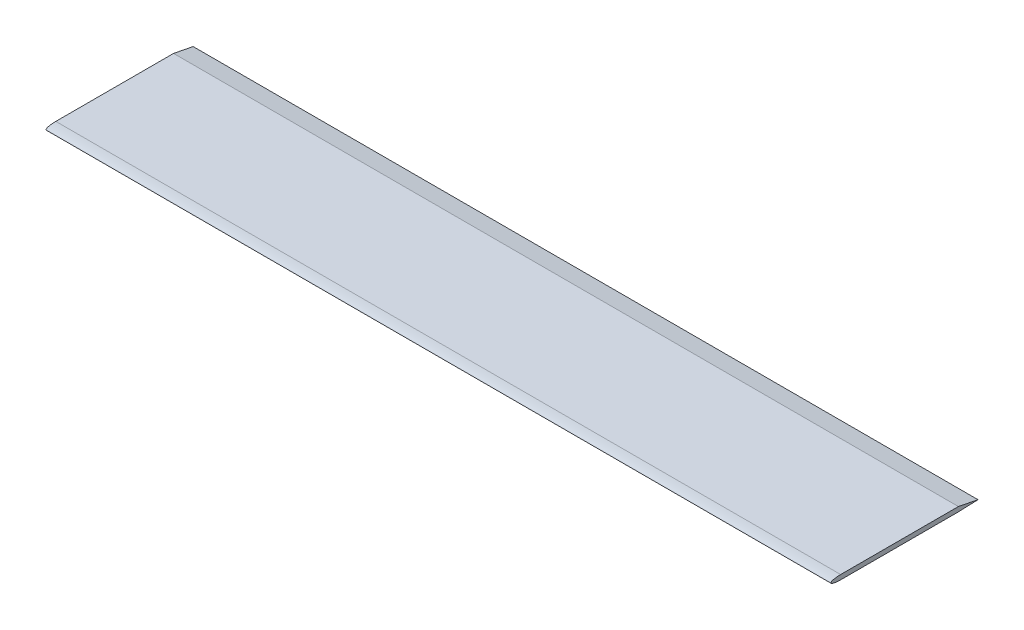
ISO-10303-21;
HEADER;
FILE_DESCRIPTION(('STEP AP214'),'2;1');
FILE_NAME('part.step','',(''),(''),'','','');
FILE_SCHEMA(('AUTOMOTIVE_DESIGN { 1 0 10303 214 1 1 1 1 }'));
ENDSEC;
DATA;
#1=APPLICATION_CONTEXT('core data for automotive mechanical design processes');
#2=APPLICATION_PROTOCOL_DEFINITION('international standard','automotive_design',2000,#1);
#3=PRODUCT_CONTEXT('',#1,'mechanical');
#4=PRODUCT('Part','Part','',(#3));
#5=PRODUCT_RELATED_PRODUCT_CATEGORY('part','',(#4));
#6=PRODUCT_DEFINITION_FORMATION('','',#4);
#7=PRODUCT_DEFINITION_CONTEXT('part definition',#1,'design');
#8=PRODUCT_DEFINITION('design','',#6,#7);
#9=PRODUCT_DEFINITION_SHAPE('','',#8);
#10=(LENGTH_UNIT() NAMED_UNIT(*) SI_UNIT(.MILLI.,.METRE.));
#11=(NAMED_UNIT(*) PLANE_ANGLE_UNIT() SI_UNIT($,.RADIAN.));
#12=(NAMED_UNIT(*) SI_UNIT($,.STERADIAN.) SOLID_ANGLE_UNIT());
#13=UNCERTAINTY_MEASURE_WITH_UNIT(LENGTH_MEASURE(1.E-05),#10,'distance_accuracy_value','');
#14=(GEOMETRIC_REPRESENTATION_CONTEXT(3) GLOBAL_UNCERTAINTY_ASSIGNED_CONTEXT((#13)) GLOBAL_UNIT_ASSIGNED_CONTEXT((#10,
#11,#12)) REPRESENTATION_CONTEXT('',''));
#15=CARTESIAN_POINT('',(0.,0.,0.));
#16=DIRECTION('',(0.,0.,1.));
#17=DIRECTION('',(1.,0.,0.));
#18=AXIS2_PLACEMENT_3D('',#15,#16,#17);
#19=CARTESIAN_POINT('',(1016.,2.999999969,0.));
#20=DIRECTION('',(0.,-1.,0.));
#21=DIRECTION('',(0.,0.,-1.));
#22=AXIS2_PLACEMENT_3D('',#19,#20,#21);
#23=PLANE('',#22);
#24=DIRECTION('',(0.,0.,1.));
#25=VECTOR('',#24,1.);
#26=CARTESIAN_POINT('',(0.,2.999999969,0.));
#27=LINE('',#26,#25);
#28=CARTESIAN_POINT('',(0.,2.999999969,-150.728463895618));
#29=VERTEX_POINT('',#28);
#30=CARTESIAN_POINT('',(0.,2.999999969,1.6715361043822));
#31=VERTEX_POINT('',#30);
#32=EDGE_CURVE('E109',#29,#31,#27,.T.);
#33=ORIENTED_EDGE('',*,*,#32,.T.);
#34=DIRECTION('',(-1.,0.,0.));
#35=VECTOR('',#34,1.);
#36=CARTESIAN_POINT('',(1016.,2.999999969,1.6715361043822));
#37=LINE('',#36,#35);
#38=CARTESIAN_POINT('',(1016.,2.999999969,1.6715361043822));
#39=VERTEX_POINT('',#38);
#40=EDGE_CURVE('E11',#39,#31,#37,.T.);
#41=ORIENTED_EDGE('',*,*,#40,.F.);
#42=DIRECTION('',(0.,0.,1.));
#43=VECTOR('',#42,1.);
#44=CARTESIAN_POINT('',(1016.,2.999999969,0.));
#45=LINE('',#44,#43);
#46=CARTESIAN_POINT('',(1016.,2.999999969,-150.728463895618));
#47=VERTEX_POINT('',#46);
#48=EDGE_CURVE('E120',#47,#39,#45,.T.);
#49=ORIENTED_EDGE('',*,*,#48,.F.);
#50=DIRECTION('',(-1.,0.,0.));
#51=VECTOR('',#50,1.);
#52=CARTESIAN_POINT('',(1016.,2.999999969,-150.728463895618));
#53=LINE('',#52,#51);
#54=EDGE_CURVE('E51',#47,#29,#53,.T.);
#55=ORIENTED_EDGE('',*,*,#54,.T.);
#56=EDGE_LOOP('',(#33,#41,#49,#55));
#57=FACE_BOUND('',#56,.T.);
#58=ADVANCED_FACE('F35',(#57),#23,.F.);
#59=CARTESIAN_POINT('',(1016.,0.,1.6715361043822));
#60=DIRECTION('',(1.,0.,0.));
#61=DIRECTION('',(0.,0.,-1.));
#62=AXIS2_PLACEMENT_3D('',#59,#60,#61);
#63=ELLIPSE('',#62,12.7,2.999999969);
#64=DIRECTION('',(-1.,0.,0.));
#65=VECTOR('',#64,1.);
#66=SURFACE_OF_LINEAR_EXTRUSION('',#63,#65);
#67=CARTESIAN_POINT('',(0.,0.,1.6715361043822));
#68=DIRECTION('',(1.,0.,0.));
#69=DIRECTION('',(0.,0.,-1.));
#70=AXIS2_PLACEMENT_3D('',#67,#68,#69);
#71=ELLIPSE('',#70,12.7,2.999999969);
#72=CARTESIAN_POINT('',(0.,-2.999999969,1.6715361043822));
#73=VERTEX_POINT('',#72);
#74=EDGE_CURVE('E111',#31,#73,#71,.T.);
#75=ORIENTED_EDGE('',*,*,#74,.T.);
#76=DIRECTION('',(-1.,0.,0.));
#77=VECTOR('',#76,1.);
#78=CARTESIAN_POINT('',(1016.,-2.999999969,1.6715361043822));
#79=LINE('',#78,#77);
#80=CARTESIAN_POINT('',(1016.,-2.999999969,1.6715361043822));
#81=VERTEX_POINT('',#80);
#82=EDGE_CURVE('E43',#81,#73,#79,.T.);
#83=ORIENTED_EDGE('',*,*,#82,.F.);
#84=EDGE_CURVE('E80',#39,#81,#63,.T.);
#85=ORIENTED_EDGE('',*,*,#84,.F.);
#86=ORIENTED_EDGE('',*,*,#40,.T.);
#87=EDGE_LOOP('',(#75,#83,#85,#86));
#88=FACE_BOUND('',#87,.T.);
#89=ADVANCED_FACE('F122',(#88),#66,.F.);
#90=CARTESIAN_POINT('',(1016.,-2.999999969,0.));
#91=DIRECTION('',(0.,-1.,0.));
#92=DIRECTION('',(0.,0.,-1.));
#93=AXIS2_PLACEMENT_3D('',#90,#91,#92);
#94=PLANE('',#93);
#95=DIRECTION('',(0.,0.,1.));
#96=VECTOR('',#95,1.);
#97=CARTESIAN_POINT('',(0.,-2.999999969,0.));
#98=LINE('',#97,#96);
#99=CARTESIAN_POINT('',(0.,-2.999999969,-150.728463895618));
#100=VERTEX_POINT('',#99);
#101=EDGE_CURVE('E92',#100,#73,#98,.T.);
#102=ORIENTED_EDGE('',*,*,#101,.F.);
#103=DIRECTION('',(-1.,0.,0.));
#104=VECTOR('',#103,1.);
#105=CARTESIAN_POINT('',(1016.,-2.999999969,-150.728463895618));
#106=LINE('',#105,#104);
#107=CARTESIAN_POINT('',(1016.,-2.999999969,-150.728463895618));
#108=VERTEX_POINT('',#107);
#109=EDGE_CURVE('E87',#108,#100,#106,.T.);
#110=ORIENTED_EDGE('',*,*,#109,.F.);
#111=DIRECTION('',(0.,0.,1.));
#112=VECTOR('',#111,1.);
#113=CARTESIAN_POINT('',(1016.,-2.999999969,0.));
#114=LINE('',#113,#112);
#115=EDGE_CURVE('E90',#108,#81,#114,.T.);
#116=ORIENTED_EDGE('',*,*,#115,.T.);
#117=ORIENTED_EDGE('',*,*,#82,.T.);
#118=EDGE_LOOP('',(#102,#110,#116,#117));
#119=FACE_BOUND('',#118,.T.);
#120=ADVANCED_FACE('F89',(#119),#94,.T.);
#121=CARTESIAN_POINT('',(1016.,-8.92036505647198,-0.351195485902507));
#122=DIRECTION('',(0.,-0.999225898179474,-0.0393396035493978));
#123=DIRECTION('',(0.,0.0393396035493978,-0.999225898179474));
#124=AXIS2_PLACEMENT_3D('',#121,#122,#123);
#125=PLANE('',#124);
#126=DIRECTION('',(0.,-0.0393396035493978,0.999225898179474));
#127=VECTOR('',#126,1.);
#128=CARTESIAN_POINT('',(0.,-8.92036505647198,-0.351195485902507));
#129=LINE('',#128,#127);
#130=CARTESIAN_POINT('',(0.,-1.999999937,-176.128463895618));
#131=VERTEX_POINT('',#130);
#132=EDGE_CURVE('E115',#131,#100,#129,.T.);
#133=ORIENTED_EDGE('',*,*,#132,.F.);
#134=DIRECTION('',(-1.,0.,0.));
#135=VECTOR('',#134,1.);
#136=CARTESIAN_POINT('',(1016.,-1.999999937,-176.128463895618));
#137=LINE('',#136,#135);
#138=CARTESIAN_POINT('',(1016.,-1.999999937,-176.128463895618));
#139=VERTEX_POINT('',#138);
#140=EDGE_CURVE('E68',#139,#131,#137,.T.);
#141=ORIENTED_EDGE('',*,*,#140,.F.);
#142=DIRECTION('',(0.,-0.0393396035493978,0.999225898179474));
#143=VECTOR('',#142,1.);
#144=CARTESIAN_POINT('',(1016.,-8.92036505647198,-0.351195485902507));
#145=LINE('',#144,#143);
#146=EDGE_CURVE('E101',#139,#108,#145,.T.);
#147=ORIENTED_EDGE('',*,*,#146,.T.);
#148=ORIENTED_EDGE('',*,*,#109,.T.);
#149=EDGE_LOOP('',(#133,#141,#147,#148));
#150=FACE_BOUND('',#149,.T.);
#151=ADVANCED_FACE('F103',(#150),#125,.T.);
#152=CARTESIAN_POINT('',(1016.,31.4521824108112,-6.19137437391933));
#153=DIRECTION('',(0.,0.981170462793096,-0.193143788257301));
#154=DIRECTION('',(0.,0.193143788257301,0.981170462793096));
#155=AXIS2_PLACEMENT_3D('',#152,#153,#154);
#156=PLANE('',#155);
#157=DIRECTION('',(0.,-0.193143788257301,-0.981170462793096));
#158=VECTOR('',#157,1.);
#159=CARTESIAN_POINT('',(0.,31.4521824108112,-6.19137437391933));
#160=LINE('',#159,#158);
#161=EDGE_CURVE('E117',#29,#131,#160,.T.);
#162=ORIENTED_EDGE('',*,*,#161,.F.);
#163=ORIENTED_EDGE('',*,*,#54,.F.);
#164=DIRECTION('',(0.,-0.193143788257301,-0.981170462793096));
#165=VECTOR('',#164,1.);
#166=CARTESIAN_POINT('',(1016.,31.4521824108112,-6.19137437391933));
#167=LINE('',#166,#165);
#168=EDGE_CURVE('E104',#47,#139,#167,.T.);
#169=ORIENTED_EDGE('',*,*,#168,.T.);
#170=ORIENTED_EDGE('',*,*,#140,.T.);
#171=EDGE_LOOP('',(#162,#163,#169,#170));
#172=FACE_BOUND('',#171,.T.);
#173=ADVANCED_FACE('F126',(#172),#156,.T.);
#174=CARTESIAN_POINT('',(1016.,0.,0.));
#175=DIRECTION('',(1.,0.,0.));
#176=DIRECTION('',(0.,0.,-1.));
#177=AXIS2_PLACEMENT_3D('',#174,#175,#176);
#178=PLANE('',#177);
#179=ORIENTED_EDGE('',*,*,#48,.T.);
#180=ORIENTED_EDGE('',*,*,#84,.T.);
#181=ORIENTED_EDGE('',*,*,#115,.F.);
#182=ORIENTED_EDGE('',*,*,#146,.F.);
#183=ORIENTED_EDGE('',*,*,#168,.F.);
#184=EDGE_LOOP('',(#179,#180,#181,#182,#183));
#185=FACE_BOUND('',#184,.T.);
#186=ADVANCED_FACE('F99',(#185),#178,.T.);
#187=CARTESIAN_POINT('',(0.,0.,0.));
#188=DIRECTION('',(1.,0.,0.));
#189=DIRECTION('',(0.,0.,-1.));
#190=AXIS2_PLACEMENT_3D('',#187,#188,#189);
#191=PLANE('',#190);
#192=ORIENTED_EDGE('',*,*,#32,.F.);
#193=ORIENTED_EDGE('',*,*,#161,.T.);
#194=ORIENTED_EDGE('',*,*,#132,.T.);
#195=ORIENTED_EDGE('',*,*,#101,.T.);
#196=ORIENTED_EDGE('',*,*,#74,.F.);
#197=EDGE_LOOP('',(#192,#193,#194,#195,#196));
#198=FACE_BOUND('',#197,.T.);
#199=ADVANCED_FACE('F125',(#198),#191,.F.);
#200=CLOSED_SHELL('',(#58,#89,#120,#151,#173,#186,#199));
#201=MANIFOLD_SOLID_BREP('B2',#200);
#202=ADVANCED_BREP_SHAPE_REPRESENTATION('',(#18,#201),#14);
#203=SHAPE_DEFINITION_REPRESENTATION(#9,#202);
ENDSEC;
END-ISO-10303-21;
